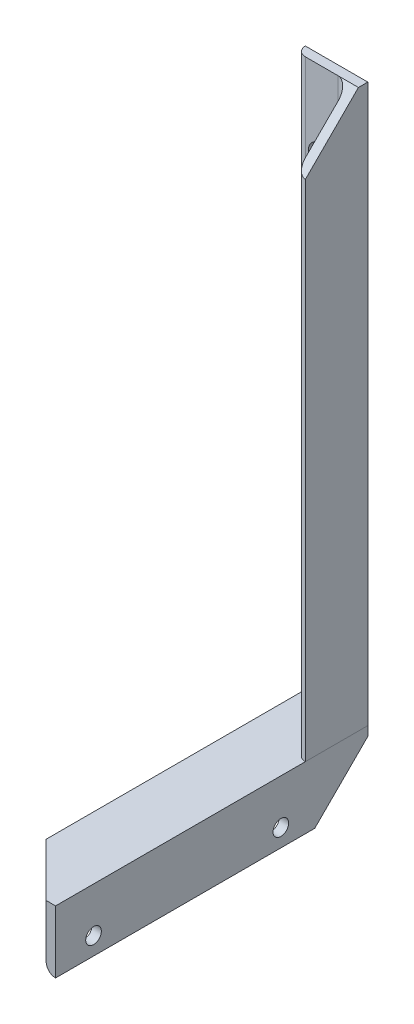
ISO-10303-21;
HEADER;
FILE_DESCRIPTION(('STEP AP214'),'2;1');
FILE_NAME('part.step','',(''),(''),'','','');
FILE_SCHEMA(('AUTOMOTIVE_DESIGN { 1 0 10303 214 1 1 1 1 }'));
ENDSEC;
DATA;
#1=APPLICATION_CONTEXT('core data for automotive mechanical design processes');
#2=APPLICATION_PROTOCOL_DEFINITION('international standard','automotive_design',2000,#1);
#3=PRODUCT_CONTEXT('',#1,'mechanical');
#4=PRODUCT('Part','Part','',(#3));
#5=PRODUCT_RELATED_PRODUCT_CATEGORY('part','',(#4));
#6=PRODUCT_DEFINITION_FORMATION('','',#4);
#7=PRODUCT_DEFINITION_CONTEXT('part definition',#1,'design');
#8=PRODUCT_DEFINITION('design','',#6,#7);
#9=PRODUCT_DEFINITION_SHAPE('','',#8);
#10=(LENGTH_UNIT() NAMED_UNIT(*) SI_UNIT(.MILLI.,.METRE.));
#11=(NAMED_UNIT(*) PLANE_ANGLE_UNIT() SI_UNIT($,.RADIAN.));
#12=(NAMED_UNIT(*) SI_UNIT($,.STERADIAN.) SOLID_ANGLE_UNIT());
#13=UNCERTAINTY_MEASURE_WITH_UNIT(LENGTH_MEASURE(1.E-05),#10,'distance_accuracy_value','');
#14=(GEOMETRIC_REPRESENTATION_CONTEXT(3) GLOBAL_UNCERTAINTY_ASSIGNED_CONTEXT((#13)) GLOBAL_UNIT_ASSIGNED_CONTEXT((#10,
#11,#12)) REPRESENTATION_CONTEXT('',''));
#15=CARTESIAN_POINT('',(0.,0.,0.));
#16=DIRECTION('',(0.,0.,1.));
#17=DIRECTION('',(1.,0.,0.));
#18=AXIS2_PLACEMENT_3D('',#15,#16,#17);
#19=CARTESIAN_POINT('',(-94.7895397458245,-16.7182966589366,3.));
#20=DIRECTION('',(0.,0.,1.));
#21=DIRECTION('',(1.,0.,0.));
#22=AXIS2_PLACEMENT_3D('',#19,#20,#21);
#23=PLANE('',#22);
#24=DIRECTION('',(-1.,0.,0.));
#25=VECTOR('',#24,1.);
#26=CARTESIAN_POINT('',(-94.7895397458245,-16.7182966589366,3.));
#27=LINE('',#26,#25);
#28=CARTESIAN_POINT('',(-94.7895397458245,-16.7182966589366,3.));
#29=VERTEX_POINT('',#28);
#30=CARTESIAN_POINT('',(-105.289539745824,-16.7182966589366,3.));
#31=VERTEX_POINT('',#30);
#32=EDGE_CURVE('E207',#29,#31,#27,.T.);
#33=ORIENTED_EDGE('',*,*,#32,.F.);
#34=DIRECTION('',(0.,1.,0.));
#35=VECTOR('',#34,1.);
#36=CARTESIAN_POINT('',(-94.7895397458245,-16.7182966589366,3.00000000000001));
#37=LINE('',#36,#35);
#38=CARTESIAN_POINT('',(-94.7895397458245,161.781703341063,3.00000000000001));
#39=VERTEX_POINT('',#38);
#40=EDGE_CURVE('E219',#29,#39,#37,.T.);
#41=ORIENTED_EDGE('',*,*,#40,.T.);
#42=DIRECTION('',(1.,0.,0.));
#43=VECTOR('',#42,1.);
#44=CARTESIAN_POINT('',(-94.7895397458245,161.781703341063,3.));
#45=LINE('',#44,#43);
#46=CARTESIAN_POINT('',(-105.289539745824,161.781703341063,3.));
#47=VERTEX_POINT('',#46);
#48=EDGE_CURVE('E227',#47,#39,#45,.T.);
#49=ORIENTED_EDGE('',*,*,#48,.F.);
#50=DIRECTION('',(0.,1.,0.));
#51=VECTOR('',#50,1.);
#52=CARTESIAN_POINT('',(-105.289539745824,-16.7182966589367,3.));
#53=LINE('',#52,#51);
#54=EDGE_CURVE('E119',#31,#47,#53,.T.);
#55=ORIENTED_EDGE('',*,*,#54,.F.);
#56=EDGE_LOOP('',(#33,#41,#49,#55));
#57=FACE_BOUND('',#56,.T.);
#58=CARTESIAN_POINT('',(-100.636844694995,76.4548053198479,3.));
#59=DIRECTION('',(0.,0.,1.));
#60=DIRECTION('',(1.,0.,0.));
#61=AXIS2_PLACEMENT_3D('',#58,#59,#60);
#62=CIRCLE('',#61,3.49999999999999);
#63=CARTESIAN_POINT('',(-97.136844694995,76.4548053198479,3.));
#64=VERTEX_POINT('',#63);
#65=EDGE_CURVE('E241',#64,#64,#62,.T.);
#66=ORIENTED_EDGE('',*,*,#65,.F.);
#67=EDGE_LOOP('',(#66));
#68=FACE_BOUND('',#67,.T.);
#69=CARTESIAN_POINT('',(-100.636844694995,136.454805319848,3.));
#70=DIRECTION('',(0.,0.,1.));
#71=DIRECTION('',(1.,0.,0.));
#72=AXIS2_PLACEMENT_3D('',#69,#70,#71);
#73=CIRCLE('',#72,3.67267955215581);
#74=CARTESIAN_POINT('',(-96.9641651428392,136.454805319848,3.));
#75=VERTEX_POINT('',#74);
#76=EDGE_CURVE('E248',#75,#75,#73,.T.);
#77=ORIENTED_EDGE('',*,*,#76,.F.);
#78=EDGE_LOOP('',(#77));
#79=FACE_BOUND('',#78,.T.);
#80=ADVANCED_FACE('F115',(#57,#68,#79),#23,.T.);
#81=CARTESIAN_POINT('',(-94.7895397458245,-16.7182966589366,6.5));
#82=DIRECTION('',(0.,1.,0.));
#83=DIRECTION('',(0.,0.,1.));
#84=AXIS2_PLACEMENT_3D('',#81,#82,#83);
#85=CYLINDRICAL_SURFACE('',#84,3.49999999999999);
#86=CARTESIAN_POINT('',(-94.7895397458245,-16.7182966589366,6.5));
#87=DIRECTION('',(0.,1.,0.));
#88=DIRECTION('',(-1.,0.,0.));
#89=AXIS2_PLACEMENT_3D('',#86,#87,#88);
#90=CIRCLE('',#89,3.49999999999999);
#91=CARTESIAN_POINT('',(-91.2895397458245,-16.7182966589366,6.5));
#92=VERTEX_POINT('',#91);
#93=EDGE_CURVE('E205',#92,#29,#90,.T.);
#94=ORIENTED_EDGE('',*,*,#93,.F.);
#95=DIRECTION('',(0.,1.,0.));
#96=VECTOR('',#95,1.);
#97=CARTESIAN_POINT('',(-91.2895397458245,-16.7182966589366,6.5));
#98=LINE('',#97,#96);
#99=CARTESIAN_POINT('',(-91.2895397458245,158.281703341063,6.49999999999999));
#100=VERTEX_POINT('',#99);
#101=EDGE_CURVE('E218',#92,#100,#98,.T.);
#102=ORIENTED_EDGE('',*,*,#101,.T.);
#103=CARTESIAN_POINT('',(-94.7895397458245,158.281703341063,6.5));
#104=DIRECTION('',(0.,-0.707106781186548,-0.707106781186547));
#105=DIRECTION('',(0.,0.707106781186547,-0.707106781186548));
#106=AXIS2_PLACEMENT_3D('',#103,#104,#105);
#107=ELLIPSE('',#106,4.94974746830582,3.49999999999999);
#108=EDGE_CURVE('E238',#39,#100,#107,.T.);
#109=ORIENTED_EDGE('',*,*,#108,.F.);
#110=ORIENTED_EDGE('',*,*,#40,.F.);
#111=EDGE_LOOP('',(#94,#102,#109,#110));
#112=FACE_BOUND('',#111,.T.);
#113=ADVANCED_FACE('F239',(#112),#85,.F.);
#114=CARTESIAN_POINT('',(-91.2895397458245,-16.7182966589366,17.));
#115=DIRECTION('',(-1.,0.,0.));
#116=DIRECTION('',(0.,0.,1.));
#117=AXIS2_PLACEMENT_3D('',#114,#115,#116);
#118=PLANE('',#117);
#119=DIRECTION('',(0.,0.,-1.));
#120=VECTOR('',#119,1.);
#121=CARTESIAN_POINT('',(-91.2895397458245,-16.7182966589366,17.));
#122=LINE('',#121,#120);
#123=CARTESIAN_POINT('',(-91.2895397458245,-16.7182966589366,17.));
#124=VERTEX_POINT('',#123);
#125=EDGE_CURVE('E199',#124,#92,#122,.T.);
#126=ORIENTED_EDGE('',*,*,#125,.F.);
#127=DIRECTION('',(0.,1.,0.));
#128=VECTOR('',#127,1.);
#129=CARTESIAN_POINT('',(-91.2895397458245,-16.7182966589366,17.));
#130=LINE('',#129,#128);
#131=CARTESIAN_POINT('',(-91.2895397458245,147.781703341063,17.));
#132=VERTEX_POINT('',#131);
#133=EDGE_CURVE('E216',#124,#132,#130,.T.);
#134=ORIENTED_EDGE('',*,*,#133,.T.);
#135=DIRECTION('',(0.,-0.707106781186547,0.707106781186548));
#136=VECTOR('',#135,1.);
#137=CARTESIAN_POINT('',(-91.2895397458245,65.5317033410636,99.25));
#138=LINE('',#137,#136);
#139=EDGE_CURVE('E192',#100,#132,#138,.T.);
#140=ORIENTED_EDGE('',*,*,#139,.F.);
#141=ORIENTED_EDGE('',*,*,#101,.F.);
#142=EDGE_LOOP('',(#126,#134,#140,#141));
#143=FACE_BOUND('',#142,.T.);
#144=ADVANCED_FACE('F280',(#143),#118,.T.);
#145=CARTESIAN_POINT('',(-88.2895397458245,161.781703341063,17.));
#146=DIRECTION('',(0.,1.,0.));
#147=DIRECTION('',(-1.,0.,0.));
#148=AXIS2_PLACEMENT_3D('',#145,#146,#147);
#149=PLANE('',#148);
#150=DIRECTION('',(1.,0.,0.));
#151=VECTOR('',#150,1.);
#152=CARTESIAN_POINT('',(-98.2895397458245,161.781703341063,3.00000000000001));
#153=LINE('',#152,#151);
#154=CARTESIAN_POINT('',(-88.2895397458245,161.781703341063,3.00000000000001));
#155=VERTEX_POINT('',#154);
#156=EDGE_CURVE('E202',#39,#155,#153,.T.);
#157=ORIENTED_EDGE('',*,*,#156,.T.);
#158=DIRECTION('',(0.,0.,-1.));
#159=VECTOR('',#158,1.);
#160=CARTESIAN_POINT('',(-88.2895397458245,161.781703341063,20.));
#161=LINE('',#160,#159);
#162=CARTESIAN_POINT('',(-88.2895397458245,161.781703341063,0.));
#163=VERTEX_POINT('',#162);
#164=EDGE_CURVE('E197',#155,#163,#161,.T.);
#165=ORIENTED_EDGE('',*,*,#164,.T.);
#166=DIRECTION('',(-1.,0.,0.));
#167=VECTOR('',#166,1.);
#168=CARTESIAN_POINT('',(-108.289539745824,161.781703341063,0.));
#169=LINE('',#168,#167);
#170=CARTESIAN_POINT('',(-108.289539745824,161.781703341063,0.));
#171=VERTEX_POINT('',#170);
#172=EDGE_CURVE('E251',#163,#171,#169,.T.);
#173=ORIENTED_EDGE('',*,*,#172,.T.);
#174=CARTESIAN_POINT('',(-105.289539745824,161.781703341063,0.));
#175=DIRECTION('',(0.,1.,0.));
#176=DIRECTION('',(-1.,0.,0.));
#177=AXIS2_PLACEMENT_3D('',#174,#175,#176);
#178=CIRCLE('',#177,3.);
#179=EDGE_CURVE('E236',#171,#47,#178,.T.);
#180=ORIENTED_EDGE('',*,*,#179,.T.);
#181=ORIENTED_EDGE('',*,*,#48,.T.);
#182=EDGE_LOOP('',(#157,#165,#173,#180,#181));
#183=FACE_BOUND('',#182,.T.);
#184=ADVANCED_FACE('F233',(#183),#149,.T.);
#185=CARTESIAN_POINT('',(-105.289539745824,-16.7182966589367,0.));
#186=DIRECTION('',(0.,1.,0.));
#187=DIRECTION('',(0.,0.,1.));
#188=AXIS2_PLACEMENT_3D('',#185,#186,#187);
#189=CYLINDRICAL_SURFACE('',#188,3.);
#190=CARTESIAN_POINT('',(-105.289539745824,-16.7182966589366,0.));
#191=DIRECTION('',(0.,1.,0.));
#192=DIRECTION('',(-1.,0.,0.));
#193=AXIS2_PLACEMENT_3D('',#190,#191,#192);
#194=CIRCLE('',#193,3.);
#195=CARTESIAN_POINT('',(-108.289539745824,-16.7182966589366,0.));
#196=VERTEX_POINT('',#195);
#197=EDGE_CURVE('E124',#31,#196,#194,.F.);
#198=ORIENTED_EDGE('',*,*,#197,.F.);
#199=ORIENTED_EDGE('',*,*,#54,.T.);
#200=ORIENTED_EDGE('',*,*,#179,.F.);
#201=DIRECTION('',(0.,1.,0.));
#202=VECTOR('',#201,1.);
#203=CARTESIAN_POINT('',(-108.289539745824,-16.7182966589367,0.));
#204=LINE('',#203,#202);
#205=EDGE_CURVE('E212',#196,#171,#204,.T.);
#206=ORIENTED_EDGE('',*,*,#205,.F.);
#207=EDGE_LOOP('',(#198,#199,#200,#206));
#208=FACE_BOUND('',#207,.T.);
#209=ADVANCED_FACE('F117',(#208),#189,.T.);
#210=CARTESIAN_POINT('',(-88.2895397458245,-16.7182966589366,17.));
#211=DIRECTION('',(0.,1.,0.));
#212=DIRECTION('',(0.,0.,1.));
#213=AXIS2_PLACEMENT_3D('',#210,#211,#212);
#214=CYLINDRICAL_SURFACE('',#213,3.);
#215=CARTESIAN_POINT('',(-88.2895397458245,-16.7182966589366,17.));
#216=DIRECTION('',(0.,1.,0.));
#217=DIRECTION('',(-1.,0.,0.));
#218=AXIS2_PLACEMENT_3D('',#215,#216,#217);
#219=CIRCLE('',#218,3.);
#220=CARTESIAN_POINT('',(-88.2895397458245,-16.7182966589366,20.));
#221=VERTEX_POINT('',#220);
#222=EDGE_CURVE('E180',#221,#124,#219,.F.);
#223=ORIENTED_EDGE('',*,*,#222,.F.);
#224=DIRECTION('',(0.,1.,0.));
#225=VECTOR('',#224,1.);
#226=CARTESIAN_POINT('',(-88.2895397458245,-16.7182966589366,20.));
#227=LINE('',#226,#225);
#228=CARTESIAN_POINT('',(-88.2895397458245,144.781703341063,20.));
#229=VERTEX_POINT('',#228);
#230=EDGE_CURVE('E175',#221,#229,#227,.T.);
#231=ORIENTED_EDGE('',*,*,#230,.T.);
#232=CARTESIAN_POINT('',(-88.2895397458245,147.781703341063,17.));
#233=DIRECTION('',(0.,-0.707106781186548,-0.707106781186547));
#234=DIRECTION('',(0.,0.707106781186547,-0.707106781186548));
#235=AXIS2_PLACEMENT_3D('',#232,#233,#234);
#236=ELLIPSE('',#235,4.24264068711928,3.);
#237=EDGE_CURVE('E179',#132,#229,#236,.F.);
#238=ORIENTED_EDGE('',*,*,#237,.F.);
#239=ORIENTED_EDGE('',*,*,#133,.F.);
#240=EDGE_LOOP('',(#223,#231,#238,#239));
#241=FACE_BOUND('',#240,.T.);
#242=ADVANCED_FACE('F177',(#241),#214,.T.);
#243=CARTESIAN_POINT('',(-88.2895397458245,-16.7182966589366,20.));
#244=DIRECTION('',(1.,0.,0.));
#245=DIRECTION('',(0.,0.,-1.));
#246=AXIS2_PLACEMENT_3D('',#243,#244,#245);
#247=PLANE('',#246);
#248=DIRECTION('',(0.,0.,-1.));
#249=VECTOR('',#248,1.);
#250=CARTESIAN_POINT('',(-88.2895397458245,-16.7182966589366,100.));
#251=LINE('',#250,#249);
#252=CARTESIAN_POINT('',(-88.2895397458245,-16.7182966589366,0.));
#253=VERTEX_POINT('',#252);
#254=EDGE_CURVE('E131',#221,#253,#251,.T.);
#255=ORIENTED_EDGE('',*,*,#254,.T.);
#256=DIRECTION('',(0.,1.,0.));
#257=VECTOR('',#256,1.);
#258=CARTESIAN_POINT('',(-88.2895397458245,-16.7182966589366,0.));
#259=LINE('',#258,#257);
#260=EDGE_CURVE('E211',#253,#163,#259,.T.);
#261=ORIENTED_EDGE('',*,*,#260,.T.);
#262=ORIENTED_EDGE('',*,*,#164,.F.);
#263=DIRECTION('',(0.,0.707106781186547,-0.707106781186548));
#264=VECTOR('',#263,1.);
#265=CARTESIAN_POINT('',(-88.2895397458245,144.781703341063,20.));
#266=LINE('',#265,#264);
#267=EDGE_CURVE('E189',#229,#155,#266,.T.);
#268=ORIENTED_EDGE('',*,*,#267,.F.);
#269=ORIENTED_EDGE('',*,*,#230,.F.);
#270=EDGE_LOOP('',(#255,#261,#262,#268,#269));
#271=FACE_BOUND('',#270,.T.);
#272=ADVANCED_FACE('F195',(#271),#247,.T.);
#273=CARTESIAN_POINT('',(-108.289539745824,-16.7182966589367,0.));
#274=DIRECTION('',(0.,0.,-1.));
#275=DIRECTION('',(-1.,0.,0.));
#276=AXIS2_PLACEMENT_3D('',#273,#274,#275);
#277=PLANE('',#276);
#278=DIRECTION('',(1.,0.,0.));
#279=VECTOR('',#278,1.);
#280=CARTESIAN_POINT('',(-108.289539745824,-16.7182966589366,0.));
#281=LINE('',#280,#279);
#282=EDGE_CURVE('E14',#196,#253,#281,.T.);
#283=ORIENTED_EDGE('',*,*,#282,.F.);
#284=ORIENTED_EDGE('',*,*,#205,.T.);
#285=ORIENTED_EDGE('',*,*,#172,.F.);
#286=ORIENTED_EDGE('',*,*,#260,.F.);
#287=EDGE_LOOP('',(#283,#284,#285,#286));
#288=FACE_BOUND('',#287,.T.);
#289=CARTESIAN_POINT('',(-100.636844694995,76.4548053198479,0.));
#290=DIRECTION('',(0.,0.,-1.));
#291=DIRECTION('',(-1.,0.,0.));
#292=AXIS2_PLACEMENT_3D('',#289,#290,#291);
#293=CIRCLE('',#292,3.49999999999999);
#294=CARTESIAN_POINT('',(-104.136844694995,76.4548053198479,0.));
#295=VERTEX_POINT('',#294);
#296=EDGE_CURVE('E245',#295,#295,#293,.T.);
#297=ORIENTED_EDGE('',*,*,#296,.F.);
#298=EDGE_LOOP('',(#297));
#299=FACE_BOUND('',#298,.T.);
#300=CARTESIAN_POINT('',(-100.636844694995,136.454805319848,0.));
#301=DIRECTION('',(0.,0.,-1.));
#302=DIRECTION('',(-1.,0.,0.));
#303=AXIS2_PLACEMENT_3D('',#300,#301,#302);
#304=CIRCLE('',#303,3.67267955215581);
#305=CARTESIAN_POINT('',(-104.309524247151,136.454805319848,0.));
#306=VERTEX_POINT('',#305);
#307=EDGE_CURVE('E214',#306,#306,#304,.T.);
#308=ORIENTED_EDGE('',*,*,#307,.F.);
#309=EDGE_LOOP('',(#308));
#310=FACE_BOUND('',#309,.T.);
#311=ADVANCED_FACE('F263',(#288,#299,#310),#277,.T.);
#312=CARTESIAN_POINT('',(-100.636844694995,136.454805319848,-197.));
#313=DIRECTION('',(0.,0.,1.));
#314=DIRECTION('',(1.,0.,0.));
#315=AXIS2_PLACEMENT_3D('',#312,#313,#314);
#316=CYLINDRICAL_SURFACE('',#315,3.67267955215581);
#317=ORIENTED_EDGE('',*,*,#307,.T.);
#318=EDGE_LOOP('',(#317));
#319=FACE_BOUND('',#318,.T.);
#320=ORIENTED_EDGE('',*,*,#76,.T.);
#321=EDGE_LOOP('',(#320));
#322=FACE_BOUND('',#321,.T.);
#323=ADVANCED_FACE('F266',(#319,#322),#316,.F.);
#324=CARTESIAN_POINT('',(-100.636844694995,76.4548053198479,-197.));
#325=DIRECTION('',(0.,0.,1.));
#326=DIRECTION('',(1.,0.,0.));
#327=AXIS2_PLACEMENT_3D('',#324,#325,#326);
#328=CYLINDRICAL_SURFACE('',#327,3.49999999999999);
#329=ORIENTED_EDGE('',*,*,#296,.T.);
#330=EDGE_LOOP('',(#329));
#331=FACE_BOUND('',#330,.T.);
#332=ORIENTED_EDGE('',*,*,#65,.T.);
#333=EDGE_LOOP('',(#332));
#334=FACE_BOUND('',#333,.T.);
#335=ADVANCED_FACE('F260',(#331,#334),#328,.F.);
#336=CARTESIAN_POINT('',(-98.2895397458245,144.781703341063,20.));
#337=DIRECTION('',(0.,-0.707106781186548,-0.707106781186547));
#338=DIRECTION('',(0.,0.707106781186547,-0.707106781186548));
#339=AXIS2_PLACEMENT_3D('',#336,#337,#338);
#340=PLANE('',#339);
#341=ORIENTED_EDGE('',*,*,#108,.T.);
#342=ORIENTED_EDGE('',*,*,#139,.T.);
#343=ORIENTED_EDGE('',*,*,#237,.T.);
#344=ORIENTED_EDGE('',*,*,#267,.T.);
#345=ORIENTED_EDGE('',*,*,#156,.F.);
#346=EDGE_LOOP('',(#341,#342,#343,#344,#345));
#347=FACE_BOUND('',#346,.T.);
#348=ADVANCED_FACE('F187',(#347),#340,.F.);
#349=CARTESIAN_POINT('',(-108.289539745824,-16.7182966589366,100.));
#350=DIRECTION('',(0.,1.,0.));
#351=DIRECTION('',(-1.,0.,0.));
#352=AXIS2_PLACEMENT_3D('',#349,#350,#351);
#353=PLANE('',#352);
#354=ORIENTED_EDGE('',*,*,#222,.T.);
#355=ORIENTED_EDGE('',*,*,#125,.T.);
#356=ORIENTED_EDGE('',*,*,#93,.T.);
#357=ORIENTED_EDGE('',*,*,#32,.T.);
#358=ORIENTED_EDGE('',*,*,#197,.T.);
#359=ORIENTED_EDGE('',*,*,#282,.T.);
#360=ORIENTED_EDGE('',*,*,#254,.F.);
#361=EDGE_LOOP('',(#354,#355,#356,#357,#358,#359,#360));
#362=FACE_BOUND('',#361,.T.);
#363=ADVANCED_FACE('F290',(#362),#353,.F.);
#364=CLOSED_SHELL('',(#80,#113,#144,#184,#209,#242,#272,#311,#323,#335,#348,#363));
#365=MANIFOLD_SOLID_BREP('B2',#364);
#366=CARTESIAN_POINT('',(-88.2895397458245,-16.7182966589366,0.));
#367=DIRECTION('',(0.,0.,-1.));
#368=DIRECTION('',(0.,1.,0.));
#369=AXIS2_PLACEMENT_3D('',#366,#367,#368);
#370=PLANE('',#369);
#371=DIRECTION('',(1.,0.,0.));
#372=VECTOR('',#371,1.);
#373=CARTESIAN_POINT('',(-98.2895397458245,-19.7182966589366,0.));
#374=LINE('',#373,#372);
#375=CARTESIAN_POINT('',(-94.7895397458245,-19.7182966589366,0.));
#376=VERTEX_POINT('',#375);
#377=CARTESIAN_POINT('',(-88.2895397458245,-19.7182966589366,0.));
#378=VERTEX_POINT('',#377);
#379=EDGE_CURVE('E478',#376,#378,#374,.T.);
#380=ORIENTED_EDGE('',*,*,#379,.F.);
#381=DIRECTION('',(1.,0.,0.));
#382=VECTOR('',#381,1.);
#383=CARTESIAN_POINT('',(-105.289539745824,-19.7182966589366,0.));
#384=LINE('',#383,#382);
#385=CARTESIAN_POINT('',(-105.289539745824,-19.7182966589366,0.));
#386=VERTEX_POINT('',#385);
#387=EDGE_CURVE('E510',#386,#376,#384,.T.);
#388=ORIENTED_EDGE('',*,*,#387,.F.);
#389=CARTESIAN_POINT('',(-105.289539745824,-16.7182966589366,0.));
#390=DIRECTION('',(0.,0.,-1.));
#391=DIRECTION('',(0.,1.,0.));
#392=AXIS2_PLACEMENT_3D('',#389,#390,#391);
#393=CIRCLE('',#392,3.);
#394=CARTESIAN_POINT('',(-108.289539745824,-16.7182966589366,0.));
#395=VERTEX_POINT('',#394);
#396=EDGE_CURVE('E514',#395,#386,#393,.F.);
#397=ORIENTED_EDGE('',*,*,#396,.F.);
#398=DIRECTION('',(-1.,0.,0.));
#399=VECTOR('',#398,1.);
#400=CARTESIAN_POINT('',(-108.289539745824,-16.7182966589366,0.));
#401=LINE('',#400,#399);
#402=CARTESIAN_POINT('',(-88.2895397458245,-16.7182966589366,0.));
#403=VERTEX_POINT('',#402);
#404=EDGE_CURVE('E500',#403,#395,#401,.T.);
#405=ORIENTED_EDGE('',*,*,#404,.F.);
#406=DIRECTION('',(0.,1.,0.));
#407=VECTOR('',#406,1.);
#408=CARTESIAN_POINT('',(-88.2895397458244,-36.7182966589366,0.));
#409=LINE('',#408,#407);
#410=EDGE_CURVE('E493',#378,#403,#409,.T.);
#411=ORIENTED_EDGE('',*,*,#410,.F.);
#412=EDGE_LOOP('',(#380,#388,#397,#405,#411));
#413=FACE_BOUND('',#412,.T.);
#414=ADVANCED_FACE('F415',(#413),#370,.T.);
#415=CARTESIAN_POINT('',(-105.289539745824,-16.7182966589366,100.));
#416=DIRECTION('',(0.,0.,-1.));
#417=DIRECTION('',(0.,-1.,0.));
#418=AXIS2_PLACEMENT_3D('',#415,#416,#417);
#419=PLANE('',#418);
#420=DIRECTION('',(1.,0.,0.));
#421=VECTOR('',#420,1.);
#422=CARTESIAN_POINT('',(-108.289539745824,-16.7182966589366,100.));
#423=LINE('',#422,#421);
#424=CARTESIAN_POINT('',(-91.2895397458245,-16.7182966589366,100.));
#425=VERTEX_POINT('',#424);
#426=CARTESIAN_POINT('',(-88.2895397458245,-16.7182966589366,100.));
#427=VERTEX_POINT('',#426);
#428=EDGE_CURVE('E519',#425,#427,#423,.T.);
#429=ORIENTED_EDGE('',*,*,#428,.F.);
#430=DIRECTION('',(0.,1.,0.));
#431=VECTOR('',#430,1.);
#432=CARTESIAN_POINT('',(-91.2895397458245,-26.7182966589366,100.));
#433=LINE('',#432,#431);
#434=CARTESIAN_POINT('',(-91.2895397458245,-23.2182966589366,100.));
#435=VERTEX_POINT('',#434);
#436=EDGE_CURVE('E613',#435,#425,#433,.T.);
#437=ORIENTED_EDGE('',*,*,#436,.F.);
#438=DIRECTION('',(0.,1.,0.));
#439=VECTOR('',#438,1.);
#440=CARTESIAN_POINT('',(-91.2895397458245,-23.2182966589366,100.));
#441=LINE('',#440,#439);
#442=CARTESIAN_POINT('',(-91.2895397458244,-33.7182966589366,100.));
#443=VERTEX_POINT('',#442);
#444=EDGE_CURVE('E527',#443,#435,#441,.T.);
#445=ORIENTED_EDGE('',*,*,#444,.F.);
#446=CARTESIAN_POINT('',(-88.2895397458244,-33.7182966589366,100.));
#447=DIRECTION('',(0.,0.,-1.));
#448=DIRECTION('',(0.,-1.,0.));
#449=AXIS2_PLACEMENT_3D('',#446,#447,#448);
#450=CIRCLE('',#449,3.);
#451=CARTESIAN_POINT('',(-88.2895397458244,-36.7182966589366,100.));
#452=VERTEX_POINT('',#451);
#453=EDGE_CURVE('E422',#452,#443,#450,.T.);
#454=ORIENTED_EDGE('',*,*,#453,.F.);
#455=DIRECTION('',(0.,-1.,0.));
#456=VECTOR('',#455,1.);
#457=CARTESIAN_POINT('',(-88.2895397458244,-36.7182966589366,100.));
#458=LINE('',#457,#456);
#459=EDGE_CURVE('E502',#427,#452,#458,.T.);
#460=ORIENTED_EDGE('',*,*,#459,.F.);
#461=EDGE_LOOP('',(#429,#437,#445,#454,#460));
#462=FACE_BOUND('',#461,.T.);
#463=ADVANCED_FACE('F564',(#462),#419,.F.);
#464=CARTESIAN_POINT('',(-98.2895397458244,-31.0451946801525,27.8431295693948));
#465=DIRECTION('',(1.,0.,0.));
#466=DIRECTION('',(0.,1.,0.));
#467=AXIS2_PLACEMENT_3D('',#464,#465,#466);
#468=CYLINDRICAL_SURFACE('',#467,2.50000000000001);
#469=CARTESIAN_POINT('',(-91.2895397458244,-31.0451946801525,27.8431295693948));
#470=DIRECTION('',(-1.,0.,0.));
#471=DIRECTION('',(0.,-1.,0.));
#472=AXIS2_PLACEMENT_3D('',#469,#470,#471);
#473=CIRCLE('',#472,2.50000000000001);
#474=CARTESIAN_POINT('',(-91.2895397458244,-33.5451946801525,27.8431295693948));
#475=VERTEX_POINT('',#474);
#476=EDGE_CURVE('E543',#475,#475,#473,.T.);
#477=ORIENTED_EDGE('',*,*,#476,.T.);
#478=EDGE_LOOP('',(#477));
#479=FACE_BOUND('',#478,.T.);
#480=CARTESIAN_POINT('',(-88.2895397458244,-31.0451946801525,27.8431295693948));
#481=DIRECTION('',(1.,0.,0.));
#482=DIRECTION('',(0.,1.,0.));
#483=AXIS2_PLACEMENT_3D('',#480,#481,#482);
#484=CIRCLE('',#483,2.50000000000001);
#485=CARTESIAN_POINT('',(-88.2895397458245,-28.5451946801525,27.8431295693948));
#486=VERTEX_POINT('',#485);
#487=EDGE_CURVE('E542',#486,#486,#484,.T.);
#488=ORIENTED_EDGE('',*,*,#487,.T.);
#489=EDGE_LOOP('',(#488));
#490=FACE_BOUND('',#489,.T.);
#491=ADVANCED_FACE('F549',(#479,#490),#468,.F.);
#492=CARTESIAN_POINT('',(-98.2895397458244,-31.0451946801525,87.8431295692936));
#493=DIRECTION('',(1.,0.,0.));
#494=DIRECTION('',(0.,1.,0.));
#495=AXIS2_PLACEMENT_3D('',#492,#493,#494);
#496=CYLINDRICAL_SURFACE('',#495,2.50000000000001);
#497=CARTESIAN_POINT('',(-91.2895397458244,-31.0451946801525,87.8431295692936));
#498=DIRECTION('',(-1.,0.,0.));
#499=DIRECTION('',(0.,-1.,0.));
#500=AXIS2_PLACEMENT_3D('',#497,#498,#499);
#501=CIRCLE('',#500,2.50000000000001);
#502=CARTESIAN_POINT('',(-91.2895397458244,-33.5451946801525,87.8431295692936));
#503=VERTEX_POINT('',#502);
#504=EDGE_CURVE('E539',#503,#503,#501,.T.);
#505=ORIENTED_EDGE('',*,*,#504,.T.);
#506=EDGE_LOOP('',(#505));
#507=FACE_BOUND('',#506,.T.);
#508=CARTESIAN_POINT('',(-88.2895397458244,-31.0451946801525,87.8431295692936));
#509=DIRECTION('',(1.,0.,0.));
#510=DIRECTION('',(0.,1.,0.));
#511=AXIS2_PLACEMENT_3D('',#508,#509,#510);
#512=CIRCLE('',#511,2.50000000000001);
#513=CARTESIAN_POINT('',(-88.2895397458245,-28.5451946801525,87.8431295692936));
#514=VERTEX_POINT('',#513);
#515=EDGE_CURVE('E506',#514,#514,#512,.T.);
#516=ORIENTED_EDGE('',*,*,#515,.T.);
#517=EDGE_LOOP('',(#516));
#518=FACE_BOUND('',#517,.T.);
#519=ADVANCED_FACE('F553',(#507,#518),#496,.F.);
#520=CARTESIAN_POINT('',(-88.2895397458244,-36.7182966589366,100.));
#521=DIRECTION('',(1.,0.,0.));
#522=DIRECTION('',(0.,1.,0.));
#523=AXIS2_PLACEMENT_3D('',#520,#521,#522);
#524=PLANE('',#523);
#525=DIRECTION('',(0.,-0.707106781186547,0.707106781186548));
#526=VECTOR('',#525,1.);
#527=CARTESIAN_POINT('',(-88.2895397458245,-19.7182966589366,0.));
#528=LINE('',#527,#526);
#529=CARTESIAN_POINT('',(-88.2895397458244,-36.7182966589366,17.));
#530=VERTEX_POINT('',#529);
#531=EDGE_CURVE('E428',#378,#530,#528,.T.);
#532=ORIENTED_EDGE('',*,*,#531,.F.);
#533=ORIENTED_EDGE('',*,*,#410,.T.);
#534=DIRECTION('',(0.,0.,-1.));
#535=VECTOR('',#534,1.);
#536=CARTESIAN_POINT('',(-88.2895397458245,-16.7182966589366,100.));
#537=LINE('',#536,#535);
#538=EDGE_CURVE('E504',#427,#403,#537,.T.);
#539=ORIENTED_EDGE('',*,*,#538,.F.);
#540=ORIENTED_EDGE('',*,*,#459,.T.);
#541=DIRECTION('',(0.,0.,-1.));
#542=VECTOR('',#541,1.);
#543=CARTESIAN_POINT('',(-88.2895397458244,-36.7182966589366,100.));
#544=LINE('',#543,#542);
#545=EDGE_CURVE('E496',#452,#530,#544,.T.);
#546=ORIENTED_EDGE('',*,*,#545,.T.);
#547=EDGE_LOOP('',(#532,#533,#539,#540,#546));
#548=FACE_BOUND('',#547,.T.);
#549=ORIENTED_EDGE('',*,*,#515,.F.);
#550=EDGE_LOOP('',(#549));
#551=FACE_BOUND('',#550,.T.);
#552=ORIENTED_EDGE('',*,*,#487,.F.);
#553=EDGE_LOOP('',(#552));
#554=FACE_BOUND('',#553,.T.);
#555=ADVANCED_FACE('F490',(#548,#551,#554),#524,.T.);
#556=CARTESIAN_POINT('',(-108.289539745824,-16.7182966589366,100.));
#557=DIRECTION('',(0.,1.,0.));
#558=DIRECTION('',(-1.,0.,0.));
#559=AXIS2_PLACEMENT_3D('',#556,#557,#558);
#560=PLANE('',#559);
#561=DIRECTION('',(-0.707106781186546,0.,-0.707106781186549));
#562=VECTOR('',#561,1.);
#563=CARTESIAN_POINT('',(-91.2895397458245,-16.7182966589366,100.));
#564=LINE('',#563,#562);
#565=CARTESIAN_POINT('',(-108.289539745824,-16.7182966589366,83.));
#566=VERTEX_POINT('',#565);
#567=EDGE_CURVE('E602',#425,#566,#564,.T.);
#568=ORIENTED_EDGE('',*,*,#567,.F.);
#569=ORIENTED_EDGE('',*,*,#428,.T.);
#570=ORIENTED_EDGE('',*,*,#538,.T.);
#571=ORIENTED_EDGE('',*,*,#404,.T.);
#572=DIRECTION('',(0.,0.,-1.));
#573=VECTOR('',#572,1.);
#574=CARTESIAN_POINT('',(-108.289539745824,-16.7182966589366,100.));
#575=LINE('',#574,#573);
#576=EDGE_CURVE('E517',#566,#395,#575,.T.);
#577=ORIENTED_EDGE('',*,*,#576,.F.);
#578=EDGE_LOOP('',(#568,#569,#570,#571,#577));
#579=FACE_BOUND('',#578,.T.);
#580=ADVANCED_FACE('F552',(#579),#560,.T.);
#581=CARTESIAN_POINT('',(-105.289539745824,-16.7182966589366,100.));
#582=DIRECTION('',(0.,0.,-1.));
#583=DIRECTION('',(-1.,0.,0.));
#584=AXIS2_PLACEMENT_3D('',#581,#582,#583);
#585=CYLINDRICAL_SURFACE('',#584,3.);
#586=CARTESIAN_POINT('',(-105.289539745824,-16.7182966589366,86.));
#587=DIRECTION('',(0.707106781186549,0.,-0.707106781186546));
#588=DIRECTION('',(-0.707106781186546,0.,-0.707106781186549));
#589=AXIS2_PLACEMENT_3D('',#586,#587,#588);
#590=ELLIPSE('',#589,4.24264068711929,3.);
#591=CARTESIAN_POINT('',(-105.289539745824,-19.7182966589366,86.));
#592=VERTEX_POINT('',#591);
#593=EDGE_CURVE('E545',#566,#592,#590,.F.);
#594=ORIENTED_EDGE('',*,*,#593,.F.);
#595=ORIENTED_EDGE('',*,*,#576,.T.);
#596=ORIENTED_EDGE('',*,*,#396,.T.);
#597=DIRECTION('',(0.,0.,-1.));
#598=VECTOR('',#597,1.);
#599=CARTESIAN_POINT('',(-105.289539745824,-19.7182966589366,100.));
#600=LINE('',#599,#598);
#601=EDGE_CURVE('E513',#592,#386,#600,.T.);
#602=ORIENTED_EDGE('',*,*,#601,.F.);
#603=EDGE_LOOP('',(#594,#595,#596,#602));
#604=FACE_BOUND('',#603,.T.);
#605=ADVANCED_FACE('F558',(#604),#585,.T.);
#606=CARTESIAN_POINT('',(-105.289539745824,-19.7182966589366,100.));
#607=DIRECTION('',(0.,-1.,0.));
#608=DIRECTION('',(1.,0.,0.));
#609=AXIS2_PLACEMENT_3D('',#606,#607,#608);
#610=PLANE('',#609);
#611=DIRECTION('',(0.707106781186546,0.,0.707106781186549));
#612=VECTOR('',#611,1.);
#613=CARTESIAN_POINT('',(-98.2895397458245,-19.7182966589366,93.0000000000001));
#614=LINE('',#613,#612);
#615=CARTESIAN_POINT('',(-94.7895397458245,-19.7182966589366,96.5000000000001));
#616=VERTEX_POINT('',#615);
#617=EDGE_CURVE('E436',#592,#616,#614,.T.);
#618=ORIENTED_EDGE('',*,*,#617,.F.);
#619=ORIENTED_EDGE('',*,*,#601,.T.);
#620=ORIENTED_EDGE('',*,*,#387,.T.);
#621=DIRECTION('',(0.,0.,-1.));
#622=VECTOR('',#621,1.);
#623=CARTESIAN_POINT('',(-94.7895397458245,-19.7182966589366,100.));
#624=LINE('',#623,#622);
#625=EDGE_CURVE('E512',#616,#376,#624,.T.);
#626=ORIENTED_EDGE('',*,*,#625,.F.);
#627=EDGE_LOOP('',(#618,#619,#620,#626));
#628=FACE_BOUND('',#627,.T.);
#629=ADVANCED_FACE('F589',(#628),#610,.T.);
#630=CARTESIAN_POINT('',(-94.7895397458245,-23.2182966589366,100.));
#631=DIRECTION('',(0.,0.,-1.));
#632=DIRECTION('',(-1.,0.,0.));
#633=AXIS2_PLACEMENT_3D('',#630,#631,#632);
#634=CYLINDRICAL_SURFACE('',#633,3.49999999999999);
#635=CARTESIAN_POINT('',(-94.7895397458245,-23.2182966589366,3.5));
#636=DIRECTION('',(0.,0.707106781186548,0.707106781186547));
#637=DIRECTION('',(0.,0.707106781186547,-0.707106781186548));
#638=AXIS2_PLACEMENT_3D('',#635,#636,#637);
#639=ELLIPSE('',#638,4.94974746830583,3.49999999999999);
#640=CARTESIAN_POINT('',(-91.2895397458245,-23.2182966589366,3.49999999999998));
#641=VERTEX_POINT('',#640);
#642=EDGE_CURVE('E481',#641,#376,#639,.T.);
#643=ORIENTED_EDGE('',*,*,#642,.F.);
#644=DIRECTION('',(0.,0.,-1.));
#645=VECTOR('',#644,1.);
#646=CARTESIAN_POINT('',(-91.2895397458245,-23.2182966589366,100.));
#647=LINE('',#646,#645);
#648=EDGE_CURVE('E524',#435,#641,#647,.T.);
#649=ORIENTED_EDGE('',*,*,#648,.F.);
#650=CARTESIAN_POINT('',(-94.7895397458245,-23.2182966589366,96.5000000000001));
#651=DIRECTION('',(0.707106781186549,0.,-0.707106781186546));
#652=DIRECTION('',(-0.707106781186546,0.,-0.707106781186549));
#653=AXIS2_PLACEMENT_3D('',#650,#651,#652);
#654=ELLIPSE('',#653,4.94974746830583,3.49999999999999);
#655=EDGE_CURVE('E615',#616,#435,#654,.T.);
#656=ORIENTED_EDGE('',*,*,#655,.F.);
#657=ORIENTED_EDGE('',*,*,#625,.T.);
#658=EDGE_LOOP('',(#643,#649,#656,#657));
#659=FACE_BOUND('',#658,.T.);
#660=ADVANCED_FACE('F586',(#659),#634,.F.);
#661=CARTESIAN_POINT('',(-91.2895397458245,-23.2182966589366,100.));
#662=DIRECTION('',(-1.,0.,0.));
#663=DIRECTION('',(0.,-1.,0.));
#664=AXIS2_PLACEMENT_3D('',#661,#662,#663);
#665=PLANE('',#664);
#666=DIRECTION('',(0.,0.707106781186547,-0.707106781186548));
#667=VECTOR('',#666,1.);
#668=CARTESIAN_POINT('',(-91.2895397458243,-71.4682966589366,51.75));
#669=LINE('',#668,#667);
#670=CARTESIAN_POINT('',(-91.2895397458244,-33.7182966589366,14.));
#671=VERTEX_POINT('',#670);
#672=EDGE_CURVE('E486',#671,#641,#669,.T.);
#673=ORIENTED_EDGE('',*,*,#672,.F.);
#674=DIRECTION('',(0.,0.,-1.));
#675=VECTOR('',#674,1.);
#676=CARTESIAN_POINT('',(-91.2895397458244,-33.7182966589366,100.));
#677=LINE('',#676,#675);
#678=EDGE_CURVE('E528',#443,#671,#677,.T.);
#679=ORIENTED_EDGE('',*,*,#678,.F.);
#680=ORIENTED_EDGE('',*,*,#444,.T.);
#681=ORIENTED_EDGE('',*,*,#648,.T.);
#682=EDGE_LOOP('',(#673,#679,#680,#681));
#683=FACE_BOUND('',#682,.T.);
#684=ORIENTED_EDGE('',*,*,#504,.F.);
#685=EDGE_LOOP('',(#684));
#686=FACE_BOUND('',#685,.T.);
#687=ORIENTED_EDGE('',*,*,#476,.F.);
#688=EDGE_LOOP('',(#687));
#689=FACE_BOUND('',#688,.T.);
#690=ADVANCED_FACE('F583',(#683,#686,#689),#665,.T.);
#691=CARTESIAN_POINT('',(-88.2895397458244,-33.7182966589366,100.));
#692=DIRECTION('',(0.,0.,-1.));
#693=DIRECTION('',(-1.,0.,0.));
#694=AXIS2_PLACEMENT_3D('',#691,#692,#693);
#695=CYLINDRICAL_SURFACE('',#694,3.);
#696=CARTESIAN_POINT('',(-88.2895397458244,-33.7182966589366,14.));
#697=DIRECTION('',(0.,0.707106781186548,0.707106781186547));
#698=DIRECTION('',(0.,0.707106781186547,-0.707106781186548));
#699=AXIS2_PLACEMENT_3D('',#696,#697,#698);
#700=ELLIPSE('',#699,4.24264068711929,3.);
#701=EDGE_CURVE('E113',#530,#671,#700,.F.);
#702=ORIENTED_EDGE('',*,*,#701,.F.);
#703=ORIENTED_EDGE('',*,*,#545,.F.);
#704=ORIENTED_EDGE('',*,*,#453,.T.);
#705=ORIENTED_EDGE('',*,*,#678,.T.);
#706=EDGE_LOOP('',(#702,#703,#704,#705));
#707=FACE_BOUND('',#706,.T.);
#708=ADVANCED_FACE('F580',(#707),#695,.T.);
#709=CARTESIAN_POINT('',(-91.2895397458245,-26.7182966589366,100.));
#710=DIRECTION('',(0.707106781186549,0.,-0.707106781186546));
#711=DIRECTION('',(-0.707106781186546,0.,-0.707106781186549));
#712=AXIS2_PLACEMENT_3D('',#709,#710,#711);
#713=PLANE('',#712);
#714=ORIENTED_EDGE('',*,*,#593,.T.);
#715=ORIENTED_EDGE('',*,*,#617,.T.);
#716=ORIENTED_EDGE('',*,*,#655,.T.);
#717=ORIENTED_EDGE('',*,*,#436,.T.);
#718=ORIENTED_EDGE('',*,*,#567,.T.);
#719=EDGE_LOOP('',(#714,#715,#716,#717,#718));
#720=FACE_BOUND('',#719,.T.);
#721=ADVANCED_FACE('F577',(#720),#713,.F.);
#722=CARTESIAN_POINT('',(-98.2895397458245,-19.7182966589366,0.));
#723=DIRECTION('',(0.,0.707106781186548,0.707106781186547));
#724=DIRECTION('',(0.,-0.707106781186547,0.707106781186548));
#725=AXIS2_PLACEMENT_3D('',#722,#723,#724);
#726=PLANE('',#725);
#727=ORIENTED_EDGE('',*,*,#642,.T.);
#728=ORIENTED_EDGE('',*,*,#379,.T.);
#729=ORIENTED_EDGE('',*,*,#531,.T.);
#730=ORIENTED_EDGE('',*,*,#701,.T.);
#731=ORIENTED_EDGE('',*,*,#672,.T.);
#732=EDGE_LOOP('',(#727,#728,#729,#730,#731));
#733=FACE_BOUND('',#732,.T.);
#734=ADVANCED_FACE('F479',(#733),#726,.F.);
#735=CLOSED_SHELL('',(#414,#463,#491,#519,#555,#580,#605,#629,#660,#690,#708,#721,#734));
#736=MANIFOLD_SOLID_BREP('B8',#735);
#737=ADVANCED_BREP_SHAPE_REPRESENTATION('',(#18,#365,#736),#14);
#738=SHAPE_DEFINITION_REPRESENTATION(#9,#737);
ENDSEC;
END-ISO-10303-21;
